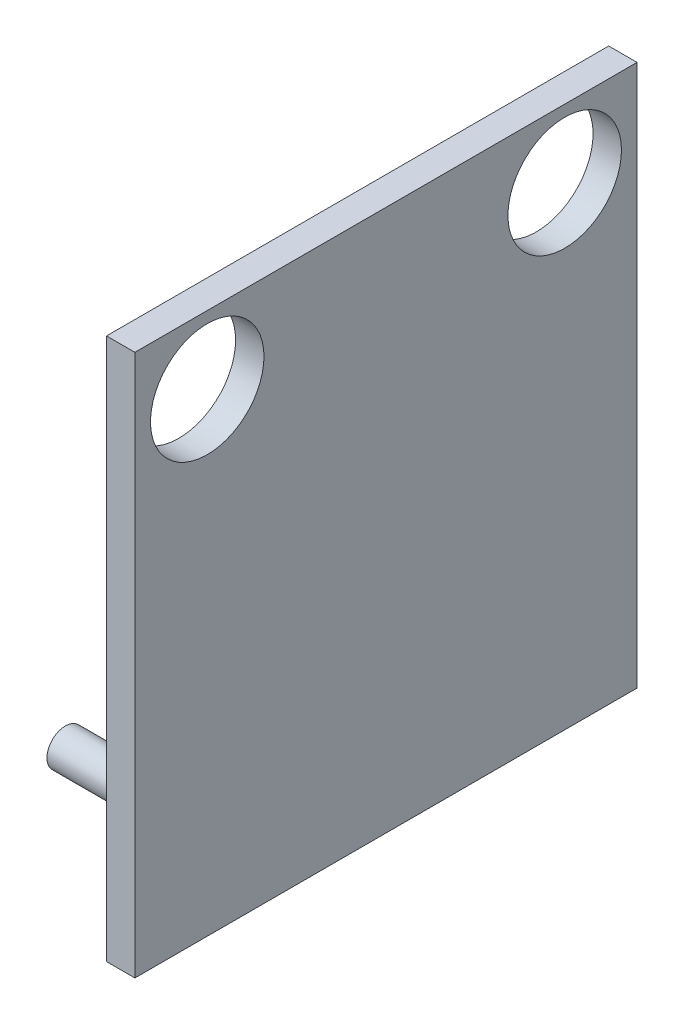
ISO-10303-21;
HEADER;
FILE_DESCRIPTION(('STEP AP214'),'2;1');
FILE_NAME('part.step','',(''),(''),'','','');
FILE_SCHEMA(('AUTOMOTIVE_DESIGN { 1 0 10303 214 1 1 1 1 }'));
ENDSEC;
DATA;
#1=APPLICATION_CONTEXT('core data for automotive mechanical design processes');
#2=APPLICATION_PROTOCOL_DEFINITION('international standard','automotive_design',2000,#1);
#3=PRODUCT_CONTEXT('',#1,'mechanical');
#4=PRODUCT('Part','Part','',(#3));
#5=PRODUCT_RELATED_PRODUCT_CATEGORY('part','',(#4));
#6=PRODUCT_DEFINITION_FORMATION('','',#4);
#7=PRODUCT_DEFINITION_CONTEXT('part definition',#1,'design');
#8=PRODUCT_DEFINITION('design','',#6,#7);
#9=PRODUCT_DEFINITION_SHAPE('','',#8);
#10=(LENGTH_UNIT() NAMED_UNIT(*) SI_UNIT(.MILLI.,.METRE.));
#11=(NAMED_UNIT(*) PLANE_ANGLE_UNIT() SI_UNIT($,.RADIAN.));
#12=(NAMED_UNIT(*) SI_UNIT($,.STERADIAN.) SOLID_ANGLE_UNIT());
#13=UNCERTAINTY_MEASURE_WITH_UNIT(LENGTH_MEASURE(1.E-05),#10,'distance_accuracy_value','');
#14=(GEOMETRIC_REPRESENTATION_CONTEXT(3) GLOBAL_UNCERTAINTY_ASSIGNED_CONTEXT((#13)) GLOBAL_UNIT_ASSIGNED_CONTEXT((#10,
#11,#12)) REPRESENTATION_CONTEXT('',''));
#15=CARTESIAN_POINT('',(0.,0.,0.));
#16=DIRECTION('',(0.,0.,1.));
#17=DIRECTION('',(1.,0.,0.));
#18=AXIS2_PLACEMENT_3D('',#15,#16,#17);
#19=CARTESIAN_POINT('',(0.,0.,0.));
#20=DIRECTION('',(-1.,0.,0.));
#21=DIRECTION('',(0.,0.,1.));
#22=AXIS2_PLACEMENT_3D('',#19,#20,#21);
#23=PLANE('',#22);
#24=CARTESIAN_POINT('',(0.,16.7,-15.15));
#25=DIRECTION('',(1.,0.,0.));
#26=DIRECTION('',(0.,0.,-1.));
#27=AXIS2_PLACEMENT_3D('',#24,#25,#26);
#28=CIRCLE('',#27,2.);
#29=CARTESIAN_POINT('',(0.,16.7,-17.15));
#30=VERTEX_POINT('',#29);
#31=EDGE_CURVE('E198',#30,#30,#28,.T.);
#32=ORIENTED_EDGE('',*,*,#31,.T.);
#33=EDGE_LOOP('',(#32));
#34=FACE_BOUND('',#33,.T.);
#35=DIRECTION('',(0.,-1.,0.));
#36=VECTOR('',#35,1.);
#37=CARTESIAN_POINT('',(0.,0.,0.));
#38=LINE('',#37,#36);
#39=CARTESIAN_POINT('',(0.,19.1,0.));
#40=VERTEX_POINT('',#39);
#41=CARTESIAN_POINT('',(0.,0.,0.));
#42=VERTEX_POINT('',#41);
#43=EDGE_CURVE('E204',#40,#42,#38,.T.);
#44=ORIENTED_EDGE('',*,*,#43,.F.);
#45=DIRECTION('',(0.,0.,1.));
#46=VECTOR('',#45,1.);
#47=CARTESIAN_POINT('',(0.,19.1,0.));
#48=LINE('',#47,#46);
#49=CARTESIAN_POINT('',(0.,19.1,-17.7));
#50=VERTEX_POINT('',#49);
#51=EDGE_CURVE('E211',#50,#40,#48,.T.);
#52=ORIENTED_EDGE('',*,*,#51,.F.);
#53=DIRECTION('',(0.,1.,0.));
#54=VECTOR('',#53,1.);
#55=CARTESIAN_POINT('',(0.,0.,-17.7));
#56=LINE('',#55,#54);
#57=CARTESIAN_POINT('',(0.,0.,-17.7));
#58=VERTEX_POINT('',#57);
#59=EDGE_CURVE('E222',#58,#50,#56,.T.);
#60=ORIENTED_EDGE('',*,*,#59,.F.);
#61=DIRECTION('',(0.,0.,-1.));
#62=VECTOR('',#61,1.);
#63=CARTESIAN_POINT('',(0.,0.,0.));
#64=LINE('',#63,#62);
#65=EDGE_CURVE('E220',#42,#58,#64,.T.);
#66=ORIENTED_EDGE('',*,*,#65,.F.);
#67=EDGE_LOOP('',(#44,#52,#60,#66));
#68=FACE_BOUND('',#67,.T.);
#69=CARTESIAN_POINT('',(0.,16.7,-2.55));
#70=DIRECTION('',(1.,0.,0.));
#71=DIRECTION('',(0.,0.,-1.));
#72=AXIS2_PLACEMENT_3D('',#69,#70,#71);
#73=CIRCLE('',#72,2.);
#74=CARTESIAN_POINT('',(0.,16.7,-4.55));
#75=VERTEX_POINT('',#74);
#76=EDGE_CURVE('E194',#75,#75,#73,.T.);
#77=ORIENTED_EDGE('',*,*,#76,.T.);
#78=EDGE_LOOP('',(#77));
#79=FACE_BOUND('',#78,.T.);
#80=DIRECTION('',(0.,0.,1.));
#81=VECTOR('',#80,1.);
#82=CARTESIAN_POINT('',(0.,1.,-15.85));
#83=LINE('',#82,#81);
#84=CARTESIAN_POINT('',(0.,1.,-15.85));
#85=VERTEX_POINT('',#84);
#86=CARTESIAN_POINT('',(0.,1.,-1.85));
#87=VERTEX_POINT('',#86);
#88=EDGE_CURVE('E160',#85,#87,#83,.T.);
#89=ORIENTED_EDGE('',*,*,#88,.F.);
#90=DIRECTION('',(0.,-1.,0.));
#91=VECTOR('',#90,1.);
#92=CARTESIAN_POINT('',(0.,3.54,-15.85));
#93=LINE('',#92,#91);
#94=CARTESIAN_POINT('',(0.,3.54,-15.85));
#95=VERTEX_POINT('',#94);
#96=EDGE_CURVE('E157',#95,#85,#93,.T.);
#97=ORIENTED_EDGE('',*,*,#96,.F.);
#98=DIRECTION('',(0.,0.,-1.));
#99=VECTOR('',#98,1.);
#100=CARTESIAN_POINT('',(0.,3.54,-15.85));
#101=LINE('',#100,#99);
#102=CARTESIAN_POINT('',(0.,3.54,-1.85));
#103=VERTEX_POINT('',#102);
#104=EDGE_CURVE('E175',#103,#95,#101,.T.);
#105=ORIENTED_EDGE('',*,*,#104,.F.);
#106=DIRECTION('',(0.,1.,0.));
#107=VECTOR('',#106,1.);
#108=CARTESIAN_POINT('',(0.,3.54,-1.85));
#109=LINE('',#108,#107);
#110=EDGE_CURVE('E183',#87,#103,#109,.T.);
#111=ORIENTED_EDGE('',*,*,#110,.F.);
#112=EDGE_LOOP('',(#89,#97,#105,#111));
#113=FACE_BOUND('',#112,.T.);
#114=DIRECTION('',(0.,0.,1.));
#115=VECTOR('',#114,1.);
#116=CARTESIAN_POINT('',(0.,7.05,-11.35));
#117=LINE('',#116,#115);
#118=CARTESIAN_POINT('',(0.,7.05,-11.35));
#119=VERTEX_POINT('',#118);
#120=CARTESIAN_POINT('',(0.,7.05,-6.35));
#121=VERTEX_POINT('',#120);
#122=EDGE_CURVE('E156',#119,#121,#117,.T.);
#123=ORIENTED_EDGE('',*,*,#122,.F.);
#124=DIRECTION('',(0.,-1.,0.));
#125=VECTOR('',#124,1.);
#126=CARTESIAN_POINT('',(0.,12.05,-11.35));
#127=LINE('',#126,#125);
#128=CARTESIAN_POINT('',(0.,12.05,-11.35));
#129=VERTEX_POINT('',#128);
#130=EDGE_CURVE('E151',#129,#119,#127,.T.);
#131=ORIENTED_EDGE('',*,*,#130,.F.);
#132=DIRECTION('',(0.,0.,-1.));
#133=VECTOR('',#132,1.);
#134=CARTESIAN_POINT('',(0.,12.05,-11.35));
#135=LINE('',#134,#133);
#136=CARTESIAN_POINT('',(0.,12.05,-6.35));
#137=VERTEX_POINT('',#136);
#138=EDGE_CURVE('E136',#137,#129,#135,.T.);
#139=ORIENTED_EDGE('',*,*,#138,.F.);
#140=DIRECTION('',(0.,1.,0.));
#141=VECTOR('',#140,1.);
#142=CARTESIAN_POINT('',(0.,12.05,-6.35));
#143=LINE('',#142,#141);
#144=EDGE_CURVE('E144',#121,#137,#143,.T.);
#145=ORIENTED_EDGE('',*,*,#144,.F.);
#146=EDGE_LOOP('',(#123,#131,#139,#145));
#147=FACE_BOUND('',#146,.T.);
#148=ADVANCED_FACE('F44',(#34,#68,#79,#113,#147),#23,.T.);
#149=CARTESIAN_POINT('',(1.,0.,0.));
#150=DIRECTION('',(-1.,0.,0.));
#151=DIRECTION('',(0.,0.,1.));
#152=AXIS2_PLACEMENT_3D('',#149,#150,#151);
#153=PLANE('',#152);
#154=DIRECTION('',(0.,-1.,0.));
#155=VECTOR('',#154,1.);
#156=CARTESIAN_POINT('',(1.,0.,0.));
#157=LINE('',#156,#155);
#158=CARTESIAN_POINT('',(1.,19.1,0.));
#159=VERTEX_POINT('',#158);
#160=CARTESIAN_POINT('',(1.,0.,0.));
#161=VERTEX_POINT('',#160);
#162=EDGE_CURVE('E207',#159,#161,#157,.T.);
#163=ORIENTED_EDGE('',*,*,#162,.T.);
#164=DIRECTION('',(0.,0.,-1.));
#165=VECTOR('',#164,1.);
#166=CARTESIAN_POINT('',(1.,0.,0.));
#167=LINE('',#166,#165);
#168=CARTESIAN_POINT('',(1.,0.,-17.7));
#169=VERTEX_POINT('',#168);
#170=EDGE_CURVE('E210',#161,#169,#167,.T.);
#171=ORIENTED_EDGE('',*,*,#170,.T.);
#172=DIRECTION('',(0.,1.,0.));
#173=VECTOR('',#172,1.);
#174=CARTESIAN_POINT('',(1.,0.,-17.7));
#175=LINE('',#174,#173);
#176=CARTESIAN_POINT('',(1.,19.1,-17.7));
#177=VERTEX_POINT('',#176);
#178=EDGE_CURVE('E213',#169,#177,#175,.T.);
#179=ORIENTED_EDGE('',*,*,#178,.T.);
#180=DIRECTION('',(0.,0.,1.));
#181=VECTOR('',#180,1.);
#182=CARTESIAN_POINT('',(1.,19.1,0.));
#183=LINE('',#182,#181);
#184=EDGE_CURVE('E215',#177,#159,#183,.T.);
#185=ORIENTED_EDGE('',*,*,#184,.T.);
#186=EDGE_LOOP('',(#163,#171,#179,#185));
#187=FACE_BOUND('',#186,.T.);
#188=CARTESIAN_POINT('',(1.,16.7,-15.15));
#189=DIRECTION('',(1.,0.,0.));
#190=DIRECTION('',(0.,0.,-1.));
#191=AXIS2_PLACEMENT_3D('',#188,#189,#190);
#192=CIRCLE('',#191,2.);
#193=CARTESIAN_POINT('',(1.,16.7,-17.15));
#194=VERTEX_POINT('',#193);
#195=EDGE_CURVE('E201',#194,#194,#192,.T.);
#196=ORIENTED_EDGE('',*,*,#195,.F.);
#197=EDGE_LOOP('',(#196));
#198=FACE_BOUND('',#197,.T.);
#199=CARTESIAN_POINT('',(1.,16.7,-2.55));
#200=DIRECTION('',(1.,0.,0.));
#201=DIRECTION('',(0.,0.,-1.));
#202=AXIS2_PLACEMENT_3D('',#199,#200,#201);
#203=CIRCLE('',#202,2.);
#204=CARTESIAN_POINT('',(1.,16.7,-4.55));
#205=VERTEX_POINT('',#204);
#206=EDGE_CURVE('E195',#205,#205,#203,.T.);
#207=ORIENTED_EDGE('',*,*,#206,.F.);
#208=EDGE_LOOP('',(#207));
#209=FACE_BOUND('',#208,.T.);
#210=ADVANCED_FACE('F307',(#187,#198,#209),#153,.F.);
#211=CARTESIAN_POINT('',(1.,0.,0.));
#212=DIRECTION('',(0.,0.,-1.));
#213=DIRECTION('',(-1.,0.,0.));
#214=AXIS2_PLACEMENT_3D('',#211,#212,#213);
#215=PLANE('',#214);
#216=ORIENTED_EDGE('',*,*,#43,.T.);
#217=DIRECTION('',(-1.,0.,0.));
#218=VECTOR('',#217,1.);
#219=CARTESIAN_POINT('',(1.,0.,0.));
#220=LINE('',#219,#218);
#221=EDGE_CURVE('E48',#161,#42,#220,.T.);
#222=ORIENTED_EDGE('',*,*,#221,.F.);
#223=ORIENTED_EDGE('',*,*,#162,.F.);
#224=DIRECTION('',(-1.,0.,0.));
#225=VECTOR('',#224,1.);
#226=CARTESIAN_POINT('',(1.,19.1,0.));
#227=LINE('',#226,#225);
#228=EDGE_CURVE('E217',#159,#40,#227,.T.);
#229=ORIENTED_EDGE('',*,*,#228,.T.);
#230=EDGE_LOOP('',(#216,#222,#223,#229));
#231=FACE_BOUND('',#230,.T.);
#232=ADVANCED_FACE('F46',(#231),#215,.F.);
#233=CARTESIAN_POINT('',(1.,0.,0.));
#234=DIRECTION('',(0.,1.,0.));
#235=DIRECTION('',(0.,0.,1.));
#236=AXIS2_PLACEMENT_3D('',#233,#234,#235);
#237=PLANE('',#236);
#238=ORIENTED_EDGE('',*,*,#65,.T.);
#239=DIRECTION('',(-1.,0.,0.));
#240=VECTOR('',#239,1.);
#241=CARTESIAN_POINT('',(1.,0.,-17.7));
#242=LINE('',#241,#240);
#243=EDGE_CURVE('E229',#169,#58,#242,.T.);
#244=ORIENTED_EDGE('',*,*,#243,.F.);
#245=ORIENTED_EDGE('',*,*,#170,.F.);
#246=ORIENTED_EDGE('',*,*,#221,.T.);
#247=EDGE_LOOP('',(#238,#244,#245,#246));
#248=FACE_BOUND('',#247,.T.);
#249=ADVANCED_FACE('F325',(#248),#237,.F.);
#250=CARTESIAN_POINT('',(1.,0.,-17.7));
#251=DIRECTION('',(0.,0.,1.));
#252=DIRECTION('',(1.,0.,0.));
#253=AXIS2_PLACEMENT_3D('',#250,#251,#252);
#254=PLANE('',#253);
#255=ORIENTED_EDGE('',*,*,#59,.T.);
#256=DIRECTION('',(-1.,0.,0.));
#257=VECTOR('',#256,1.);
#258=CARTESIAN_POINT('',(1.,19.1,-17.7));
#259=LINE('',#258,#257);
#260=EDGE_CURVE('E227',#177,#50,#259,.T.);
#261=ORIENTED_EDGE('',*,*,#260,.F.);
#262=ORIENTED_EDGE('',*,*,#178,.F.);
#263=ORIENTED_EDGE('',*,*,#243,.T.);
#264=EDGE_LOOP('',(#255,#261,#262,#263));
#265=FACE_BOUND('',#264,.T.);
#266=ADVANCED_FACE('F322',(#265),#254,.F.);
#267=CARTESIAN_POINT('',(1.,19.1,0.));
#268=DIRECTION('',(0.,-1.,0.));
#269=DIRECTION('',(0.,0.,-1.));
#270=AXIS2_PLACEMENT_3D('',#267,#268,#269);
#271=PLANE('',#270);
#272=ORIENTED_EDGE('',*,*,#51,.T.);
#273=ORIENTED_EDGE('',*,*,#228,.F.);
#274=ORIENTED_EDGE('',*,*,#184,.F.);
#275=ORIENTED_EDGE('',*,*,#260,.T.);
#276=EDGE_LOOP('',(#272,#273,#274,#275));
#277=FACE_BOUND('',#276,.T.);
#278=ADVANCED_FACE('F318',(#277),#271,.F.);
#279=CARTESIAN_POINT('',(1.,16.7,-15.15));
#280=DIRECTION('',(-1.,0.,0.));
#281=DIRECTION('',(0.,0.,1.));
#282=AXIS2_PLACEMENT_3D('',#279,#280,#281);
#283=CYLINDRICAL_SURFACE('',#282,2.);
#284=ORIENTED_EDGE('',*,*,#195,.T.);
#285=EDGE_LOOP('',(#284));
#286=FACE_BOUND('',#285,.T.);
#287=ORIENTED_EDGE('',*,*,#31,.F.);
#288=EDGE_LOOP('',(#287));
#289=FACE_BOUND('',#288,.T.);
#290=ADVANCED_FACE('F321',(#286,#289),#283,.F.);
#291=CARTESIAN_POINT('',(1.,16.7,-2.55));
#292=DIRECTION('',(-1.,0.,0.));
#293=DIRECTION('',(0.,0.,1.));
#294=AXIS2_PLACEMENT_3D('',#291,#292,#293);
#295=CYLINDRICAL_SURFACE('',#294,2.);
#296=ORIENTED_EDGE('',*,*,#206,.T.);
#297=EDGE_LOOP('',(#296));
#298=FACE_BOUND('',#297,.T.);
#299=ORIENTED_EDGE('',*,*,#76,.F.);
#300=EDGE_LOOP('',(#299));
#301=FACE_BOUND('',#300,.T.);
#302=ADVANCED_FACE('F343',(#298,#301),#295,.F.);
#303=CARTESIAN_POINT('',(-1.,3.54,-15.85));
#304=DIRECTION('',(0.,0.,1.));
#305=DIRECTION('',(1.,0.,0.));
#306=AXIS2_PLACEMENT_3D('',#303,#304,#305);
#307=PLANE('',#306);
#308=ORIENTED_EDGE('',*,*,#96,.T.);
#309=DIRECTION('',(1.,0.,0.));
#310=VECTOR('',#309,1.);
#311=CARTESIAN_POINT('',(-1.,1.,-15.85));
#312=LINE('',#311,#310);
#313=CARTESIAN_POINT('',(-1.,1.,-15.85));
#314=VERTEX_POINT('',#313);
#315=EDGE_CURVE('E192',#314,#85,#312,.T.);
#316=ORIENTED_EDGE('',*,*,#315,.F.);
#317=DIRECTION('',(0.,-1.,0.));
#318=VECTOR('',#317,1.);
#319=CARTESIAN_POINT('',(-1.,3.54,-15.85));
#320=LINE('',#319,#318);
#321=CARTESIAN_POINT('',(-1.,3.54,-15.85));
#322=VERTEX_POINT('',#321);
#323=EDGE_CURVE('E171',#322,#314,#320,.T.);
#324=ORIENTED_EDGE('',*,*,#323,.F.);
#325=DIRECTION('',(1.,0.,0.));
#326=VECTOR('',#325,1.);
#327=CARTESIAN_POINT('',(-1.,3.54,-15.85));
#328=LINE('',#327,#326);
#329=EDGE_CURVE('E180',#322,#95,#328,.T.);
#330=ORIENTED_EDGE('',*,*,#329,.T.);
#331=EDGE_LOOP('',(#308,#316,#324,#330));
#332=FACE_BOUND('',#331,.T.);
#333=ADVANCED_FACE('F346',(#332),#307,.F.);
#334=CARTESIAN_POINT('',(-1.,1.,-15.85));
#335=DIRECTION('',(0.,1.,0.));
#336=DIRECTION('',(0.,0.,1.));
#337=AXIS2_PLACEMENT_3D('',#334,#335,#336);
#338=PLANE('',#337);
#339=ORIENTED_EDGE('',*,*,#88,.T.);
#340=DIRECTION('',(1.,0.,0.));
#341=VECTOR('',#340,1.);
#342=CARTESIAN_POINT('',(-1.,1.,-1.85));
#343=LINE('',#342,#341);
#344=CARTESIAN_POINT('',(-1.,1.,-1.85));
#345=VERTEX_POINT('',#344);
#346=EDGE_CURVE('E189',#345,#87,#343,.T.);
#347=ORIENTED_EDGE('',*,*,#346,.F.);
#348=DIRECTION('',(0.,0.,1.));
#349=VECTOR('',#348,1.);
#350=CARTESIAN_POINT('',(-1.,1.,-15.85));
#351=LINE('',#350,#349);
#352=EDGE_CURVE('E174',#314,#345,#351,.T.);
#353=ORIENTED_EDGE('',*,*,#352,.F.);
#354=ORIENTED_EDGE('',*,*,#315,.T.);
#355=EDGE_LOOP('',(#339,#347,#353,#354));
#356=FACE_BOUND('',#355,.T.);
#357=ADVANCED_FACE('F356',(#356),#338,.F.);
#358=CARTESIAN_POINT('',(-1.,3.54,-1.85));
#359=DIRECTION('',(0.,0.,-1.));
#360=DIRECTION('',(-1.,0.,0.));
#361=AXIS2_PLACEMENT_3D('',#358,#359,#360);
#362=PLANE('',#361);
#363=ORIENTED_EDGE('',*,*,#110,.T.);
#364=DIRECTION('',(1.,0.,0.));
#365=VECTOR('',#364,1.);
#366=CARTESIAN_POINT('',(-1.,3.54,-1.85));
#367=LINE('',#366,#365);
#368=CARTESIAN_POINT('',(-1.,3.54,-1.85));
#369=VERTEX_POINT('',#368);
#370=EDGE_CURVE('E69',#369,#103,#367,.T.);
#371=ORIENTED_EDGE('',*,*,#370,.F.);
#372=DIRECTION('',(0.,1.,0.));
#373=VECTOR('',#372,1.);
#374=CARTESIAN_POINT('',(-1.,3.54,-1.85));
#375=LINE('',#374,#373);
#376=EDGE_CURVE('E177',#345,#369,#375,.T.);
#377=ORIENTED_EDGE('',*,*,#376,.F.);
#378=ORIENTED_EDGE('',*,*,#346,.T.);
#379=EDGE_LOOP('',(#363,#371,#377,#378));
#380=FACE_BOUND('',#379,.T.);
#381=ADVANCED_FACE('F360',(#380),#362,.F.);
#382=CARTESIAN_POINT('',(-1.,3.54,-15.85));
#383=DIRECTION('',(0.,-1.,0.));
#384=DIRECTION('',(0.,0.,-1.));
#385=AXIS2_PLACEMENT_3D('',#382,#383,#384);
#386=PLANE('',#385);
#387=ORIENTED_EDGE('',*,*,#104,.T.);
#388=ORIENTED_EDGE('',*,*,#329,.F.);
#389=DIRECTION('',(0.,0.,-1.));
#390=VECTOR('',#389,1.);
#391=CARTESIAN_POINT('',(-1.,3.54,-15.85));
#392=LINE('',#391,#390);
#393=EDGE_CURVE('E179',#369,#322,#392,.T.);
#394=ORIENTED_EDGE('',*,*,#393,.F.);
#395=ORIENTED_EDGE('',*,*,#370,.T.);
#396=EDGE_LOOP('',(#387,#388,#394,#395));
#397=FACE_BOUND('',#396,.T.);
#398=ADVANCED_FACE('F366',(#397),#386,.F.);
#399=CARTESIAN_POINT('',(-1.,0.,0.));
#400=DIRECTION('',(-1.,0.,0.));
#401=DIRECTION('',(0.,0.,1.));
#402=AXIS2_PLACEMENT_3D('',#399,#400,#401);
#403=PLANE('',#402);
#404=CARTESIAN_POINT('',(-1.,2.27,-3.55));
#405=DIRECTION('',(-1.,0.,0.));
#406=DIRECTION('',(0.,0.,1.));
#407=AXIS2_PLACEMENT_3D('',#404,#405,#406);
#408=CIRCLE('',#407,1.15);
#409=CARTESIAN_POINT('',(-1.,2.27,-2.4));
#410=VERTEX_POINT('',#409);
#411=EDGE_CURVE('E251',#410,#410,#408,.T.);
#412=ORIENTED_EDGE('',*,*,#411,.F.);
#413=EDGE_LOOP('',(#412));
#414=FACE_BOUND('',#413,.T.);
#415=CARTESIAN_POINT('',(-1.,2.27,-6.25));
#416=DIRECTION('',(-1.,0.,0.));
#417=DIRECTION('',(0.,0.,1.));
#418=AXIS2_PLACEMENT_3D('',#415,#416,#417);
#419=CIRCLE('',#418,1.15);
#420=CARTESIAN_POINT('',(-1.,2.27,-5.1));
#421=VERTEX_POINT('',#420);
#422=EDGE_CURVE('E258',#421,#421,#419,.T.);
#423=ORIENTED_EDGE('',*,*,#422,.F.);
#424=EDGE_LOOP('',(#423));
#425=FACE_BOUND('',#424,.T.);
#426=CARTESIAN_POINT('',(-1.,2.27,-8.95));
#427=DIRECTION('',(-1.,0.,0.));
#428=DIRECTION('',(0.,0.,1.));
#429=AXIS2_PLACEMENT_3D('',#426,#427,#428);
#430=CIRCLE('',#429,1.15);
#431=CARTESIAN_POINT('',(-1.,2.27,-7.8));
#432=VERTEX_POINT('',#431);
#433=EDGE_CURVE('E264',#432,#432,#430,.T.);
#434=ORIENTED_EDGE('',*,*,#433,.F.);
#435=EDGE_LOOP('',(#434));
#436=FACE_BOUND('',#435,.T.);
#437=CARTESIAN_POINT('',(-1.,2.27,-11.65));
#438=DIRECTION('',(-1.,0.,0.));
#439=DIRECTION('',(0.,0.,1.));
#440=AXIS2_PLACEMENT_3D('',#437,#438,#439);
#441=CIRCLE('',#440,1.15);
#442=CARTESIAN_POINT('',(-1.,2.27,-10.5));
#443=VERTEX_POINT('',#442);
#444=EDGE_CURVE('E270',#443,#443,#441,.T.);
#445=ORIENTED_EDGE('',*,*,#444,.F.);
#446=EDGE_LOOP('',(#445));
#447=FACE_BOUND('',#446,.T.);
#448=CARTESIAN_POINT('',(-1.,2.27,-14.35));
#449=DIRECTION('',(-1.,0.,0.));
#450=DIRECTION('',(0.,0.,1.));
#451=AXIS2_PLACEMENT_3D('',#448,#449,#450);
#452=CIRCLE('',#451,1.15);
#453=CARTESIAN_POINT('',(-1.,2.27,-13.2));
#454=VERTEX_POINT('',#453);
#455=EDGE_CURVE('E273',#454,#454,#452,.T.);
#456=ORIENTED_EDGE('',*,*,#455,.F.);
#457=EDGE_LOOP('',(#456));
#458=FACE_BOUND('',#457,.T.);
#459=ORIENTED_EDGE('',*,*,#323,.T.);
#460=ORIENTED_EDGE('',*,*,#352,.T.);
#461=ORIENTED_EDGE('',*,*,#376,.T.);
#462=ORIENTED_EDGE('',*,*,#393,.T.);
#463=EDGE_LOOP('',(#459,#460,#461,#462));
#464=FACE_BOUND('',#463,.T.);
#465=ADVANCED_FACE('F362',(#414,#425,#436,#447,#458,#464),#403,.T.);
#466=CARTESIAN_POINT('',(-1.,12.05,-11.35));
#467=DIRECTION('',(0.,0.,1.));
#468=DIRECTION('',(1.,0.,0.));
#469=AXIS2_PLACEMENT_3D('',#466,#467,#468);
#470=PLANE('',#469);
#471=ORIENTED_EDGE('',*,*,#130,.T.);
#472=DIRECTION('',(1.,0.,0.));
#473=VECTOR('',#472,1.);
#474=CARTESIAN_POINT('',(-1.,7.05,-11.35));
#475=LINE('',#474,#473);
#476=CARTESIAN_POINT('',(-1.,7.05,-11.35));
#477=VERTEX_POINT('',#476);
#478=EDGE_CURVE('E279',#477,#119,#475,.T.);
#479=ORIENTED_EDGE('',*,*,#478,.F.);
#480=DIRECTION('',(0.,-1.,0.));
#481=VECTOR('',#480,1.);
#482=CARTESIAN_POINT('',(-1.,12.05,-11.35));
#483=LINE('',#482,#481);
#484=CARTESIAN_POINT('',(-1.,12.05,-11.35));
#485=VERTEX_POINT('',#484);
#486=EDGE_CURVE('E145',#485,#477,#483,.T.);
#487=ORIENTED_EDGE('',*,*,#486,.F.);
#488=DIRECTION('',(1.,0.,0.));
#489=VECTOR('',#488,1.);
#490=CARTESIAN_POINT('',(-1.,12.05,-11.35));
#491=LINE('',#490,#489);
#492=EDGE_CURVE('E139',#485,#129,#491,.T.);
#493=ORIENTED_EDGE('',*,*,#492,.T.);
#494=EDGE_LOOP('',(#471,#479,#487,#493));
#495=FACE_BOUND('',#494,.T.);
#496=ADVANCED_FACE('F149',(#495),#470,.F.);
#497=CARTESIAN_POINT('',(-1.,7.05,-11.35));
#498=DIRECTION('',(0.,1.,0.));
#499=DIRECTION('',(0.,0.,1.));
#500=AXIS2_PLACEMENT_3D('',#497,#498,#499);
#501=PLANE('',#500);
#502=ORIENTED_EDGE('',*,*,#122,.T.);
#503=DIRECTION('',(1.,0.,0.));
#504=VECTOR('',#503,1.);
#505=CARTESIAN_POINT('',(-1.,7.05,-6.35));
#506=LINE('',#505,#504);
#507=CARTESIAN_POINT('',(-1.,7.05,-6.35));
#508=VERTEX_POINT('',#507);
#509=EDGE_CURVE('E283',#508,#121,#506,.T.);
#510=ORIENTED_EDGE('',*,*,#509,.F.);
#511=DIRECTION('',(0.,0.,1.));
#512=VECTOR('',#511,1.);
#513=CARTESIAN_POINT('',(-1.,7.05,-11.35));
#514=LINE('',#513,#512);
#515=EDGE_CURVE('E168',#477,#508,#514,.T.);
#516=ORIENTED_EDGE('',*,*,#515,.F.);
#517=ORIENTED_EDGE('',*,*,#478,.T.);
#518=EDGE_LOOP('',(#502,#510,#516,#517));
#519=FACE_BOUND('',#518,.T.);
#520=ADVANCED_FACE('F291',(#519),#501,.F.);
#521=CARTESIAN_POINT('',(-1.,12.05,-6.35));
#522=DIRECTION('',(0.,0.,-1.));
#523=DIRECTION('',(-1.,0.,0.));
#524=AXIS2_PLACEMENT_3D('',#521,#522,#523);
#525=PLANE('',#524);
#526=ORIENTED_EDGE('',*,*,#144,.T.);
#527=DIRECTION('',(1.,0.,0.));
#528=VECTOR('',#527,1.);
#529=CARTESIAN_POINT('',(-1.,12.05,-6.35));
#530=LINE('',#529,#528);
#531=CARTESIAN_POINT('',(-1.,12.05,-6.35));
#532=VERTEX_POINT('',#531);
#533=EDGE_CURVE('E61',#532,#137,#530,.T.);
#534=ORIENTED_EDGE('',*,*,#533,.F.);
#535=DIRECTION('',(0.,1.,0.));
#536=VECTOR('',#535,1.);
#537=CARTESIAN_POINT('',(-1.,12.05,-6.35));
#538=LINE('',#537,#536);
#539=EDGE_CURVE('E166',#508,#532,#538,.T.);
#540=ORIENTED_EDGE('',*,*,#539,.F.);
#541=ORIENTED_EDGE('',*,*,#509,.T.);
#542=EDGE_LOOP('',(#526,#534,#540,#541));
#543=FACE_BOUND('',#542,.T.);
#544=ADVANCED_FACE('F287',(#543),#525,.F.);
#545=CARTESIAN_POINT('',(-1.,12.05,-11.35));
#546=DIRECTION('',(0.,-1.,0.));
#547=DIRECTION('',(0.,0.,-1.));
#548=AXIS2_PLACEMENT_3D('',#545,#546,#547);
#549=PLANE('',#548);
#550=ORIENTED_EDGE('',*,*,#138,.T.);
#551=ORIENTED_EDGE('',*,*,#492,.F.);
#552=DIRECTION('',(0.,0.,-1.));
#553=VECTOR('',#552,1.);
#554=CARTESIAN_POINT('',(-1.,12.05,-11.35));
#555=LINE('',#554,#553);
#556=EDGE_CURVE('E154',#532,#485,#555,.T.);
#557=ORIENTED_EDGE('',*,*,#556,.F.);
#558=ORIENTED_EDGE('',*,*,#533,.T.);
#559=EDGE_LOOP('',(#550,#551,#557,#558));
#560=FACE_BOUND('',#559,.T.);
#561=ADVANCED_FACE('F138',(#560),#549,.F.);
#562=CARTESIAN_POINT('',(-1.,0.,0.));
#563=DIRECTION('',(-1.,0.,0.));
#564=DIRECTION('',(0.,0.,1.));
#565=AXIS2_PLACEMENT_3D('',#562,#563,#564);
#566=PLANE('',#565);
#567=ORIENTED_EDGE('',*,*,#486,.T.);
#568=ORIENTED_EDGE('',*,*,#515,.T.);
#569=ORIENTED_EDGE('',*,*,#539,.T.);
#570=ORIENTED_EDGE('',*,*,#556,.T.);
#571=EDGE_LOOP('',(#567,#568,#569,#570));
#572=FACE_BOUND('',#571,.T.);
#573=ADVANCED_FACE('F293',(#572),#566,.T.);
#574=CARTESIAN_POINT('',(-2.,2.27,-14.35));
#575=DIRECTION('',(1.,0.,0.));
#576=DIRECTION('',(0.,0.,-1.));
#577=AXIS2_PLACEMENT_3D('',#574,#575,#576);
#578=CYLINDRICAL_SURFACE('',#577,1.15);
#579=CARTESIAN_POINT('',(-2.,2.27,-14.35));
#580=DIRECTION('',(-1.,0.,0.));
#581=DIRECTION('',(0.,0.,1.));
#582=AXIS2_PLACEMENT_3D('',#579,#580,#581);
#583=CIRCLE('',#582,1.15);
#584=CARTESIAN_POINT('',(-2.,2.27,-13.2));
#585=VERTEX_POINT('',#584);
#586=EDGE_CURVE('E276',#585,#585,#583,.T.);
#587=ORIENTED_EDGE('',*,*,#586,.F.);
#588=EDGE_LOOP('',(#587));
#589=FACE_BOUND('',#588,.T.);
#590=ORIENTED_EDGE('',*,*,#455,.T.);
#591=EDGE_LOOP('',(#590));
#592=FACE_BOUND('',#591,.T.);
#593=ADVANCED_FACE('F295',(#589,#592),#578,.T.);
#594=CARTESIAN_POINT('',(-2.,2.27,-14.35));
#595=DIRECTION('',(-1.,0.,0.));
#596=DIRECTION('',(0.,0.,1.));
#597=AXIS2_PLACEMENT_3D('',#594,#595,#596);
#598=PLANE('',#597);
#599=CARTESIAN_POINT('',(-2.,2.27,-14.35));
#600=DIRECTION('',(-1.,0.,0.));
#601=DIRECTION('',(0.,0.,1.));
#602=AXIS2_PLACEMENT_3D('',#599,#600,#601);
#603=CIRCLE('',#602,0.649999999999999);
#604=CARTESIAN_POINT('',(-2.,2.27,-13.7));
#605=VERTEX_POINT('',#604);
#606=EDGE_CURVE('E236',#605,#605,#603,.T.);
#607=ORIENTED_EDGE('',*,*,#606,.F.);
#608=EDGE_LOOP('',(#607));
#609=FACE_BOUND('',#608,.T.);
#610=ORIENTED_EDGE('',*,*,#586,.T.);
#611=EDGE_LOOP('',(#610));
#612=FACE_BOUND('',#611,.T.);
#613=ADVANCED_FACE('F301',(#609,#612),#598,.T.);
#614=CARTESIAN_POINT('',(-2.,2.27,-11.65));
#615=DIRECTION('',(1.,0.,0.));
#616=DIRECTION('',(0.,0.,-1.));
#617=AXIS2_PLACEMENT_3D('',#614,#615,#616);
#618=CYLINDRICAL_SURFACE('',#617,1.15);
#619=CARTESIAN_POINT('',(-2.,2.27,-11.65));
#620=DIRECTION('',(-1.,0.,0.));
#621=DIRECTION('',(0.,0.,1.));
#622=AXIS2_PLACEMENT_3D('',#619,#620,#621);
#623=CIRCLE('',#622,1.15);
#624=CARTESIAN_POINT('',(-2.,2.27,-10.5));
#625=VERTEX_POINT('',#624);
#626=EDGE_CURVE('E267',#625,#625,#623,.T.);
#627=ORIENTED_EDGE('',*,*,#626,.F.);
#628=EDGE_LOOP('',(#627));
#629=FACE_BOUND('',#628,.T.);
#630=ORIENTED_EDGE('',*,*,#444,.T.);
#631=EDGE_LOOP('',(#630));
#632=FACE_BOUND('',#631,.T.);
#633=ADVANCED_FACE('F463',(#629,#632),#618,.T.);
#634=CARTESIAN_POINT('',(-2.,2.27,-11.65));
#635=DIRECTION('',(-1.,0.,0.));
#636=DIRECTION('',(0.,0.,1.));
#637=AXIS2_PLACEMENT_3D('',#634,#635,#636);
#638=PLANE('',#637);
#639=CARTESIAN_POINT('',(-2.,2.27,-11.65));
#640=DIRECTION('',(-1.,0.,0.));
#641=DIRECTION('',(0.,0.,1.));
#642=AXIS2_PLACEMENT_3D('',#639,#640,#641);
#643=CIRCLE('',#642,0.650000000000001);
#644=CARTESIAN_POINT('',(-2.,2.27,-11.));
#645=VERTEX_POINT('',#644);
#646=EDGE_CURVE('E240',#645,#645,#643,.T.);
#647=ORIENTED_EDGE('',*,*,#646,.F.);
#648=EDGE_LOOP('',(#647));
#649=FACE_BOUND('',#648,.T.);
#650=ORIENTED_EDGE('',*,*,#626,.T.);
#651=EDGE_LOOP('',(#650));
#652=FACE_BOUND('',#651,.T.);
#653=ADVANCED_FACE('F474',(#649,#652),#638,.T.);
#654=CARTESIAN_POINT('',(-2.,2.27,-8.95));
#655=DIRECTION('',(1.,0.,0.));
#656=DIRECTION('',(0.,0.,-1.));
#657=AXIS2_PLACEMENT_3D('',#654,#655,#656);
#658=CYLINDRICAL_SURFACE('',#657,1.15);
#659=CARTESIAN_POINT('',(-2.,2.27,-8.95));
#660=DIRECTION('',(-1.,0.,0.));
#661=DIRECTION('',(0.,0.,1.));
#662=AXIS2_PLACEMENT_3D('',#659,#660,#661);
#663=CIRCLE('',#662,1.15);
#664=CARTESIAN_POINT('',(-2.,2.27,-7.8));
#665=VERTEX_POINT('',#664);
#666=EDGE_CURVE('E261',#665,#665,#663,.T.);
#667=ORIENTED_EDGE('',*,*,#666,.F.);
#668=EDGE_LOOP('',(#667));
#669=FACE_BOUND('',#668,.T.);
#670=ORIENTED_EDGE('',*,*,#433,.T.);
#671=EDGE_LOOP('',(#670));
#672=FACE_BOUND('',#671,.T.);
#673=ADVANCED_FACE('F484',(#669,#672),#658,.T.);
#674=CARTESIAN_POINT('',(-2.,2.27,-8.95));
#675=DIRECTION('',(-1.,0.,0.));
#676=DIRECTION('',(0.,0.,1.));
#677=AXIS2_PLACEMENT_3D('',#674,#675,#676);
#678=PLANE('',#677);
#679=CARTESIAN_POINT('',(-2.,2.27,-8.95));
#680=DIRECTION('',(-1.,0.,0.));
#681=DIRECTION('',(0.,0.,1.));
#682=AXIS2_PLACEMENT_3D('',#679,#680,#681);
#683=CIRCLE('',#682,0.649999999999999);
#684=CARTESIAN_POINT('',(-2.,2.27,-8.3));
#685=VERTEX_POINT('',#684);
#686=EDGE_CURVE('E245',#685,#685,#683,.T.);
#687=ORIENTED_EDGE('',*,*,#686,.F.);
#688=EDGE_LOOP('',(#687));
#689=FACE_BOUND('',#688,.T.);
#690=ORIENTED_EDGE('',*,*,#666,.T.);
#691=EDGE_LOOP('',(#690));
#692=FACE_BOUND('',#691,.T.);
#693=ADVANCED_FACE('F494',(#689,#692),#678,.T.);
#694=CARTESIAN_POINT('',(-2.,2.27,-6.25));
#695=DIRECTION('',(1.,0.,0.));
#696=DIRECTION('',(0.,0.,-1.));
#697=AXIS2_PLACEMENT_3D('',#694,#695,#696);
#698=CYLINDRICAL_SURFACE('',#697,1.15);
#699=CARTESIAN_POINT('',(-2.,2.27,-6.25));
#700=DIRECTION('',(-1.,0.,0.));
#701=DIRECTION('',(0.,0.,1.));
#702=AXIS2_PLACEMENT_3D('',#699,#700,#701);
#703=CIRCLE('',#702,1.15);
#704=CARTESIAN_POINT('',(-2.,2.27,-5.1));
#705=VERTEX_POINT('',#704);
#706=EDGE_CURVE('E254',#705,#705,#703,.T.);
#707=ORIENTED_EDGE('',*,*,#706,.F.);
#708=EDGE_LOOP('',(#707));
#709=FACE_BOUND('',#708,.T.);
#710=ORIENTED_EDGE('',*,*,#422,.T.);
#711=EDGE_LOOP('',(#710));
#712=FACE_BOUND('',#711,.T.);
#713=ADVANCED_FACE('F504',(#709,#712),#698,.T.);
#714=CARTESIAN_POINT('',(-2.,2.27,-6.25));
#715=DIRECTION('',(-1.,0.,0.));
#716=DIRECTION('',(0.,0.,1.));
#717=AXIS2_PLACEMENT_3D('',#714,#715,#716);
#718=PLANE('',#717);
#719=CARTESIAN_POINT('',(-2.,2.27,-6.25));
#720=DIRECTION('',(-1.,0.,0.));
#721=DIRECTION('',(0.,0.,1.));
#722=AXIS2_PLACEMENT_3D('',#719,#720,#721);
#723=CIRCLE('',#722,0.649999999999999);
#724=CARTESIAN_POINT('',(-2.,2.27,-5.6));
#725=VERTEX_POINT('',#724);
#726=EDGE_CURVE('E53',#725,#725,#723,.T.);
#727=ORIENTED_EDGE('',*,*,#726,.F.);
#728=EDGE_LOOP('',(#727));
#729=FACE_BOUND('',#728,.T.);
#730=ORIENTED_EDGE('',*,*,#706,.T.);
#731=EDGE_LOOP('',(#730));
#732=FACE_BOUND('',#731,.T.);
#733=ADVANCED_FACE('F514',(#729,#732),#718,.T.);
#734=CARTESIAN_POINT('',(-2.,2.27,-3.55));
#735=DIRECTION('',(1.,0.,0.));
#736=DIRECTION('',(0.,0.,-1.));
#737=AXIS2_PLACEMENT_3D('',#734,#735,#736);
#738=CYLINDRICAL_SURFACE('',#737,1.15);
#739=CARTESIAN_POINT('',(-2.,2.27,-3.55));
#740=DIRECTION('',(-1.,0.,0.));
#741=DIRECTION('',(0.,0.,1.));
#742=AXIS2_PLACEMENT_3D('',#739,#740,#741);
#743=CIRCLE('',#742,1.15);
#744=CARTESIAN_POINT('',(-2.,2.27,-2.4));
#745=VERTEX_POINT('',#744);
#746=EDGE_CURVE('E255',#745,#745,#743,.T.);
#747=ORIENTED_EDGE('',*,*,#746,.F.);
#748=EDGE_LOOP('',(#747));
#749=FACE_BOUND('',#748,.T.);
#750=ORIENTED_EDGE('',*,*,#411,.T.);
#751=EDGE_LOOP('',(#750));
#752=FACE_BOUND('',#751,.T.);
#753=ADVANCED_FACE('F523',(#749,#752),#738,.T.);
#754=CARTESIAN_POINT('',(-2.,2.27,-3.55));
#755=DIRECTION('',(-1.,0.,0.));
#756=DIRECTION('',(0.,0.,1.));
#757=AXIS2_PLACEMENT_3D('',#754,#755,#756);
#758=PLANE('',#757);
#759=CARTESIAN_POINT('',(-2.,2.27,-3.55));
#760=DIRECTION('',(-1.,0.,0.));
#761=DIRECTION('',(0.,0.,1.));
#762=AXIS2_PLACEMENT_3D('',#759,#760,#761);
#763=CIRCLE('',#762,0.649999999999999);
#764=CARTESIAN_POINT('',(-2.,2.27,-2.9));
#765=VERTEX_POINT('',#764);
#766=EDGE_CURVE('E11',#765,#765,#763,.T.);
#767=ORIENTED_EDGE('',*,*,#766,.F.);
#768=EDGE_LOOP('',(#767));
#769=FACE_BOUND('',#768,.T.);
#770=ORIENTED_EDGE('',*,*,#746,.T.);
#771=EDGE_LOOP('',(#770));
#772=FACE_BOUND('',#771,.T.);
#773=ADVANCED_FACE('F533',(#769,#772),#758,.T.);
#774=CARTESIAN_POINT('',(-5.,2.27,-14.35));
#775=DIRECTION('',(1.,0.,0.));
#776=DIRECTION('',(0.,0.,-1.));
#777=AXIS2_PLACEMENT_3D('',#774,#775,#776);
#778=CYLINDRICAL_SURFACE('',#777,0.649999999999999);
#779=CARTESIAN_POINT('',(-5.,2.27,-14.35));
#780=DIRECTION('',(-1.,0.,0.));
#781=DIRECTION('',(0.,0.,1.));
#782=AXIS2_PLACEMENT_3D('',#779,#780,#781);
#783=CIRCLE('',#782,0.649999999999999);
#784=CARTESIAN_POINT('',(-5.,2.27,-13.7));
#785=VERTEX_POINT('',#784);
#786=EDGE_CURVE('E249',#785,#785,#783,.T.);
#787=ORIENTED_EDGE('',*,*,#786,.F.);
#788=EDGE_LOOP('',(#787));
#789=FACE_BOUND('',#788,.T.);
#790=ORIENTED_EDGE('',*,*,#606,.T.);
#791=EDGE_LOOP('',(#790));
#792=FACE_BOUND('',#791,.T.);
#793=ADVANCED_FACE('F541',(#789,#792),#778,.T.);
#794=CARTESIAN_POINT('',(-5.,2.27,-14.35));
#795=DIRECTION('',(-1.,0.,0.));
#796=DIRECTION('',(0.,0.,1.));
#797=AXIS2_PLACEMENT_3D('',#794,#795,#796);
#798=PLANE('',#797);
#799=ORIENTED_EDGE('',*,*,#786,.T.);
#800=EDGE_LOOP('',(#799));
#801=FACE_BOUND('',#800,.T.);
#802=ADVANCED_FACE('F559',(#801),#798,.T.);
#803=CARTESIAN_POINT('',(-5.,2.27,-11.65));
#804=DIRECTION('',(1.,0.,0.));
#805=DIRECTION('',(0.,0.,-1.));
#806=AXIS2_PLACEMENT_3D('',#803,#804,#805);
#807=CYLINDRICAL_SURFACE('',#806,0.650000000000001);
#808=CARTESIAN_POINT('',(-5.,2.27,-11.65));
#809=DIRECTION('',(-1.,0.,0.));
#810=DIRECTION('',(0.,0.,1.));
#811=AXIS2_PLACEMENT_3D('',#808,#809,#810);
#812=CIRCLE('',#811,0.650000000000001);
#813=CARTESIAN_POINT('',(-5.,2.27,-11.));
#814=VERTEX_POINT('',#813);
#815=EDGE_CURVE('E850',#814,#814,#812,.T.);
#816=ORIENTED_EDGE('',*,*,#815,.F.);
#817=EDGE_LOOP('',(#816));
#818=FACE_BOUND('',#817,.T.);
#819=ORIENTED_EDGE('',*,*,#646,.T.);
#820=EDGE_LOOP('',(#819));
#821=FACE_BOUND('',#820,.T.);
#822=ADVANCED_FACE('F568',(#818,#821),#807,.T.);
#823=CARTESIAN_POINT('',(-5.,2.27,-11.65));
#824=DIRECTION('',(-1.,0.,0.));
#825=DIRECTION('',(0.,0.,1.));
#826=AXIS2_PLACEMENT_3D('',#823,#824,#825);
#827=PLANE('',#826);
#828=ORIENTED_EDGE('',*,*,#815,.T.);
#829=EDGE_LOOP('',(#828));
#830=FACE_BOUND('',#829,.T.);
#831=ADVANCED_FACE('F577',(#830),#827,.T.);
#832=CARTESIAN_POINT('',(-5.,2.27,-8.95));
#833=DIRECTION('',(1.,0.,0.));
#834=DIRECTION('',(0.,0.,-1.));
#835=AXIS2_PLACEMENT_3D('',#832,#833,#834);
#836=CYLINDRICAL_SURFACE('',#835,0.649999999999999);
#837=CARTESIAN_POINT('',(-5.,2.27,-8.95));
#838=DIRECTION('',(-1.,0.,0.));
#839=DIRECTION('',(0.,0.,1.));
#840=AXIS2_PLACEMENT_3D('',#837,#838,#839);
#841=CIRCLE('',#840,0.649999999999999);
#842=CARTESIAN_POINT('',(-5.,2.27,-8.3));
#843=VERTEX_POINT('',#842);
#844=EDGE_CURVE('E842',#843,#843,#841,.T.);
#845=ORIENTED_EDGE('',*,*,#844,.F.);
#846=EDGE_LOOP('',(#845));
#847=FACE_BOUND('',#846,.T.);
#848=ORIENTED_EDGE('',*,*,#686,.T.);
#849=EDGE_LOOP('',(#848));
#850=FACE_BOUND('',#849,.T.);
#851=ADVANCED_FACE('F586',(#847,#850),#836,.T.);
#852=CARTESIAN_POINT('',(-5.,2.27,-8.95));
#853=DIRECTION('',(-1.,0.,0.));
#854=DIRECTION('',(0.,0.,1.));
#855=AXIS2_PLACEMENT_3D('',#852,#853,#854);
#856=PLANE('',#855);
#857=ORIENTED_EDGE('',*,*,#844,.T.);
#858=EDGE_LOOP('',(#857));
#859=FACE_BOUND('',#858,.T.);
#860=ADVANCED_FACE('F595',(#859),#856,.T.);
#861=CARTESIAN_POINT('',(-5.,2.27,-6.25));
#862=DIRECTION('',(1.,0.,0.));
#863=DIRECTION('',(0.,0.,-1.));
#864=AXIS2_PLACEMENT_3D('',#861,#862,#863);
#865=CYLINDRICAL_SURFACE('',#864,0.649999999999999);
#866=CARTESIAN_POINT('',(-5.,2.27,-6.25));
#867=DIRECTION('',(-1.,0.,0.));
#868=DIRECTION('',(0.,0.,1.));
#869=AXIS2_PLACEMENT_3D('',#866,#867,#868);
#870=CIRCLE('',#869,0.649999999999999);
#871=CARTESIAN_POINT('',(-5.,2.27,-5.6));
#872=VERTEX_POINT('',#871);
#873=EDGE_CURVE('E839',#872,#872,#870,.T.);
#874=ORIENTED_EDGE('',*,*,#873,.F.);
#875=EDGE_LOOP('',(#874));
#876=FACE_BOUND('',#875,.T.);
#877=ORIENTED_EDGE('',*,*,#726,.T.);
#878=EDGE_LOOP('',(#877));
#879=FACE_BOUND('',#878,.T.);
#880=ADVANCED_FACE('F604',(#876,#879),#865,.T.);
#881=CARTESIAN_POINT('',(-5.,2.27,-6.25));
#882=DIRECTION('',(-1.,0.,0.));
#883=DIRECTION('',(0.,0.,1.));
#884=AXIS2_PLACEMENT_3D('',#881,#882,#883);
#885=PLANE('',#884);
#886=ORIENTED_EDGE('',*,*,#873,.T.);
#887=EDGE_LOOP('',(#886));
#888=FACE_BOUND('',#887,.T.);
#889=ADVANCED_FACE('F613',(#888),#885,.T.);
#890=CARTESIAN_POINT('',(-5.,2.27,-3.55));
#891=DIRECTION('',(1.,0.,0.));
#892=DIRECTION('',(0.,0.,-1.));
#893=AXIS2_PLACEMENT_3D('',#890,#891,#892);
#894=CYLINDRICAL_SURFACE('',#893,0.649999999999999);
#895=CARTESIAN_POINT('',(-5.,2.27,-3.55));
#896=DIRECTION('',(-1.,0.,0.));
#897=DIRECTION('',(0.,0.,1.));
#898=AXIS2_PLACEMENT_3D('',#895,#896,#897);
#899=CIRCLE('',#898,0.649999999999999);
#900=CARTESIAN_POINT('',(-5.,2.27,-2.9));
#901=VERTEX_POINT('',#900);
#902=EDGE_CURVE('E838',#901,#901,#899,.T.);
#903=ORIENTED_EDGE('',*,*,#902,.F.);
#904=EDGE_LOOP('',(#903));
#905=FACE_BOUND('',#904,.T.);
#906=ORIENTED_EDGE('',*,*,#766,.T.);
#907=EDGE_LOOP('',(#906));
#908=FACE_BOUND('',#907,.T.);
#909=ADVANCED_FACE('F622',(#905,#908),#894,.T.);
#910=CARTESIAN_POINT('',(-5.,2.27,-3.55));
#911=DIRECTION('',(-1.,0.,0.));
#912=DIRECTION('',(0.,0.,1.));
#913=AXIS2_PLACEMENT_3D('',#910,#911,#912);
#914=PLANE('',#913);
#915=ORIENTED_EDGE('',*,*,#902,.T.);
#916=EDGE_LOOP('',(#915));
#917=FACE_BOUND('',#916,.T.);
#918=ADVANCED_FACE('F631',(#917),#914,.T.);
#919=CLOSED_SHELL('',(#148,#210,#232,#249,#266,#278,#290,#302,#333,#357,#381,#398,#465,#496,
#520,#544,#561,#573,#593,#613,#633,#653,#673,#693,#713,#733,#753,#773,#793,#802,#822,#831,#851,
#860,#880,#889,#909,#918));
#920=MANIFOLD_SOLID_BREP('B2',#919);
#921=ADVANCED_BREP_SHAPE_REPRESENTATION('',(#18,#920),#14);
#922=SHAPE_DEFINITION_REPRESENTATION(#9,#921);
ENDSEC;
END-ISO-10303-21;
